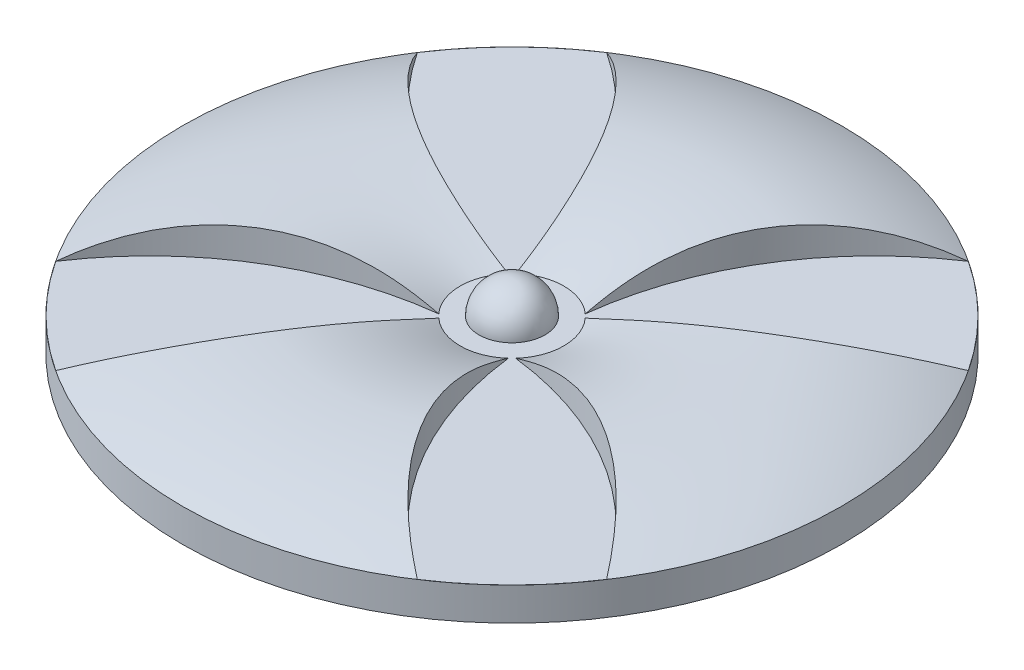
ISO-10303-21;
HEADER;
FILE_DESCRIPTION(('STEP AP214'),'2;1');
FILE_NAME('part.step','',(''),(''),'','','');
FILE_SCHEMA(('AUTOMOTIVE_DESIGN { 1 0 10303 214 1 1 1 1 }'));
ENDSEC;
DATA;
#1=APPLICATION_CONTEXT('core data for automotive mechanical design processes');
#2=APPLICATION_PROTOCOL_DEFINITION('international standard','automotive_design',2000,#1);
#3=PRODUCT_CONTEXT('',#1,'mechanical');
#4=PRODUCT('Part','Part','',(#3));
#5=PRODUCT_RELATED_PRODUCT_CATEGORY('part','',(#4));
#6=PRODUCT_DEFINITION_FORMATION('','',#4);
#7=PRODUCT_DEFINITION_CONTEXT('part definition',#1,'design');
#8=PRODUCT_DEFINITION('design','',#6,#7);
#9=PRODUCT_DEFINITION_SHAPE('','',#8);
#10=(LENGTH_UNIT() NAMED_UNIT(*) SI_UNIT(.MILLI.,.METRE.));
#11=(NAMED_UNIT(*) PLANE_ANGLE_UNIT() SI_UNIT($,.RADIAN.));
#12=(NAMED_UNIT(*) SI_UNIT($,.STERADIAN.) SOLID_ANGLE_UNIT());
#13=UNCERTAINTY_MEASURE_WITH_UNIT(LENGTH_MEASURE(1.E-05),#10,'distance_accuracy_value','');
#14=(GEOMETRIC_REPRESENTATION_CONTEXT(3) GLOBAL_UNCERTAINTY_ASSIGNED_CONTEXT((#13)) GLOBAL_UNIT_ASSIGNED_CONTEXT((#10,
#11,#12)) REPRESENTATION_CONTEXT('',''));
#15=CARTESIAN_POINT('',(0.,0.,0.));
#16=DIRECTION('',(0.,0.,1.));
#17=DIRECTION('',(1.,0.,0.));
#18=AXIS2_PLACEMENT_3D('',#15,#16,#17);
#19=CARTESIAN_POINT('',(0.,0.324,0.));
#20=DIRECTION('',(0.,-1.,0.));
#21=DIRECTION('',(0.,0.,-1.));
#22=AXIS2_PLACEMENT_3D('',#19,#20,#21);
#23=CYLINDRICAL_SURFACE('',#22,1.618);
#24=CARTESIAN_POINT('',(0.,0.161999999999954,0.));
#25=DIRECTION('',(0.,-1.,0.));
#26=DIRECTION('',(0.,0.,-1.));
#27=AXIS2_PLACEMENT_3D('',#24,#25,#26);
#28=CIRCLE('',#27,1.618);
#29=CARTESIAN_POINT('',(0.,0.162,-1.618));
#30=VERTEX_POINT('',#29);
#31=EDGE_CURVE('E445',#30,#30,#28,.T.);
#32=CARTESIAN_POINT('',(0.,0.,0.));
#33=DIRECTION('',(0.,1.,0.));
#34=DIRECTION('',(0.,0.,1.));
#35=AXIS2_PLACEMENT_3D('',#32,#33,#34);
#36=CIRCLE('',#35,1.618);
#37=CARTESIAN_POINT('',(0.,0.,-1.618));
#38=VERTEX_POINT('',#37);
#39=EDGE_CURVE('E250',#38,#38,#36,.T.);
#40=CARTESIAN_POINT('',(0.,0.162,-1.618));
#41=CARTESIAN_POINT('',(0.,0.1603125,-1.618));
#42=CARTESIAN_POINT('',(0.,0.158625,-1.618));
#43=CARTESIAN_POINT('',(0.,0.15525,-1.618));
#44=CARTESIAN_POINT('',(0.,0.1535625,-1.618));
#45=CARTESIAN_POINT('',(0.,0.1501875,-1.618));
#46=CARTESIAN_POINT('',(0.,0.1485,-1.618));
#47=CARTESIAN_POINT('',(0.,0.145125,-1.618));
#48=CARTESIAN_POINT('',(0.,0.1434375,-1.618));
#49=CARTESIAN_POINT('',(0.,0.1400625,-1.618));
#50=CARTESIAN_POINT('',(0.,0.138375,-1.618));
#51=CARTESIAN_POINT('',(0.,0.135,-1.618));
#52=CARTESIAN_POINT('',(0.,0.1333125,-1.618));
#53=CARTESIAN_POINT('',(0.,0.1299375,-1.618));
#54=CARTESIAN_POINT('',(0.,0.12825,-1.618));
#55=CARTESIAN_POINT('',(0.,0.124875,-1.618));
#56=CARTESIAN_POINT('',(0.,0.1231875,-1.618));
#57=CARTESIAN_POINT('',(0.,0.1198125,-1.618));
#58=CARTESIAN_POINT('',(0.,0.118125,-1.618));
#59=CARTESIAN_POINT('',(0.,0.11475,-1.618));
#60=CARTESIAN_POINT('',(0.,0.1130625,-1.618));
#61=CARTESIAN_POINT('',(0.,0.1096875,-1.618));
#62=CARTESIAN_POINT('',(0.,0.108,-1.618));
#63=CARTESIAN_POINT('',(0.,0.104625,-1.618));
#64=CARTESIAN_POINT('',(0.,0.1029375,-1.618));
#65=CARTESIAN_POINT('',(0.,0.0995625,-1.618));
#66=CARTESIAN_POINT('',(0.,0.0978749999999999,-1.618));
#67=CARTESIAN_POINT('',(0.,0.0945,-1.618));
#68=CARTESIAN_POINT('',(0.,0.0928125,-1.618));
#69=CARTESIAN_POINT('',(0.,0.0894375,-1.618));
#70=CARTESIAN_POINT('',(0.,0.08775,-1.618));
#71=CARTESIAN_POINT('',(0.,0.084375,-1.618));
#72=CARTESIAN_POINT('',(0.,0.0826875,-1.618));
#73=CARTESIAN_POINT('',(0.,0.0793125,-1.618));
#74=CARTESIAN_POINT('',(0.,0.077625,-1.618));
#75=CARTESIAN_POINT('',(0.,0.07425,-1.618));
#76=CARTESIAN_POINT('',(0.,0.0725625,-1.618));
#77=CARTESIAN_POINT('',(0.,0.0691875,-1.618));
#78=CARTESIAN_POINT('',(0.,0.0675,-1.618));
#79=CARTESIAN_POINT('',(0.,0.064125,-1.618));
#80=CARTESIAN_POINT('',(0.,0.0624375,-1.618));
#81=CARTESIAN_POINT('',(0.,0.0590625,-1.618));
#82=CARTESIAN_POINT('',(0.,0.057375,-1.618));
#83=CARTESIAN_POINT('',(0.,0.054,-1.618));
#84=CARTESIAN_POINT('',(0.,0.0523125,-1.618));
#85=CARTESIAN_POINT('',(0.,0.0489375,-1.618));
#86=CARTESIAN_POINT('',(0.,0.04725,-1.618));
#87=CARTESIAN_POINT('',(0.,0.043875,-1.618));
#88=CARTESIAN_POINT('',(0.,0.0421875,-1.618));
#89=CARTESIAN_POINT('',(0.,0.0388125,-1.618));
#90=CARTESIAN_POINT('',(0.,0.037125,-1.618));
#91=CARTESIAN_POINT('',(0.,0.03375,-1.618));
#92=CARTESIAN_POINT('',(0.,0.0320625,-1.618));
#93=CARTESIAN_POINT('',(0.,0.0286875,-1.618));
#94=CARTESIAN_POINT('',(0.,0.027,-1.618));
#95=CARTESIAN_POINT('',(0.,0.023625,-1.618));
#96=CARTESIAN_POINT('',(0.,0.0219375,-1.618));
#97=CARTESIAN_POINT('',(0.,0.0185625,-1.618));
#98=CARTESIAN_POINT('',(0.,0.016875,-1.618));
#99=CARTESIAN_POINT('',(0.,0.0135,-1.618));
#100=CARTESIAN_POINT('',(0.,0.0118125,-1.618));
#101=CARTESIAN_POINT('',(0.,0.00843749999999998,-1.618));
#102=CARTESIAN_POINT('',(0.,0.00674999999999997,-1.618));
#103=CARTESIAN_POINT('',(0.,0.00337499999999998,-1.618));
#104=CARTESIAN_POINT('',(0.,0.00168749999999999,-1.618));
#105=CARTESIAN_POINT('',(0.,0.,-1.618));
#106=B_SPLINE_CURVE_WITH_KNOTS('',3,(#40,#41,#42,#43,#44,#45,#46,#47,#48,#49,#50,#51,#52,#53,
#54,#55,#56,#57,#58,#59,#60,#61,#62,#63,#64,#65,#66,#67,#68,#69,#70,#71,#72,#73,#74,#75,#76,#77,
#78,#79,#80,#81,#82,#83,#84,#85,#86,#87,#88,#89,#90,#91,#92,#93,#94,#95,#96,#97,#98,#99,#100,
#101,#102,#103,#104,#105),.UNSPECIFIED.,.F.,.F.,(4,2,2,2,2,2,2,2,2,2,2,2,2,2,2,2,2,2,2,2,2,2,2,
2,2,2,2,2,2,2,2,2,4),(0.,0.00506249999999999,0.010125,0.0151875,0.02025,0.0253125,0.030375,
0.0354375,0.0405,0.0455625,0.050625,0.0556875,0.06075,0.0658125,0.070875,0.0759375,0.081,
0.0860625,0.091125,0.0961874999999999,0.10125,0.1063125,0.111375,0.1164375,0.1215,0.1265625,
0.131625,0.1366875,0.14175,0.1468125,0.151875,0.1569375,0.162),.UNSPECIFIED.);
#107=EDGE_CURVE('BSEAM243',#30,#38,#106,.T.);
#108=ORIENTED_EDGE('',*,*,#31,.T.);
#109=ORIENTED_EDGE('',*,*,#39,.T.);
#110=ORIENTED_EDGE('',*,*,#107,.T.);
#111=ORIENTED_EDGE('',*,*,#107,.F.);
#112=EDGE_LOOP('',(#108,#110,#109,#111));
#113=FACE_BOUND('',#112,.T.);
#114=ADVANCED_FACE('F243',(#113),#23,.T.);
#115=CARTESIAN_POINT('',(0.,0.,0.));
#116=DIRECTION('',(0.,1.,0.));
#117=DIRECTION('',(0.,0.,1.));
#118=AXIS2_PLACEMENT_3D('',#115,#116,#117);
#119=PLANE('',#118);
#120=ORIENTED_EDGE('',*,*,#39,.F.);
#121=EDGE_LOOP('',(#120));
#122=FACE_BOUND('',#121,.T.);
#123=ADVANCED_FACE('F389',(#122),#119,.F.);
#124=CARTESIAN_POINT('',(0.,-1.30528453187781,0.));
#125=DIRECTION('',(0.,-1.,0.));
#126=DIRECTION('',(0.,0.,-1.));
#127=AXIS2_PLACEMENT_3D('',#124,#125,#126);
#128=DEGENERATE_TOROIDAL_SURFACE('',#127,0.93609083998509,1.618,.T.);
#129=ORIENTED_EDGE('',*,*,#31,.F.);
#130=EDGE_LOOP('',(#129));
#131=FACE_BOUND('',#130,.T.);
#132=CARTESIAN_POINT('',(0.,0.1622,0.));
#133=DIRECTION('',(0.,1.,0.));
#134=DIRECTION('',(0.,0.,1.));
#135=AXIS2_PLACEMENT_3D('',#132,#133,#134);
#136=CIRCLE('',#135,0.254612191237098);
#137=CARTESIAN_POINT('',(0.170838130106348,0.162199999999998,-0.188790098332311));
#138=VERTEX_POINT('',#137);
#139=CARTESIAN_POINT('',(-0.170838130106347,0.162199999999998,-0.188790098332312));
#140=VERTEX_POINT('',#139);
#141=EDGE_CURVE('E304',#138,#140,#136,.T.);
#142=ORIENTED_EDGE('',*,*,#141,.F.);
#143=CARTESIAN_POINT('',(0.888080694463519,0.16199999999822,-1.35249276527955));
#144=CARTESIAN_POINT('',(0.860517050827818,0.176089095604927,-1.33432049104671));
#145=CARTESIAN_POINT('',(0.833207995117733,0.189304796457364,-1.31510408437488));
#146=CARTESIAN_POINT('',(0.779301533298882,0.21390226252631,-1.27457518099434));
#147=CARTESIAN_POINT('',(0.752704576087113,0.225282892630814,-1.25326139994589));
#148=CARTESIAN_POINT('',(0.674126446358543,0.256600542976333,-1.18601790688507));
#149=CARTESIAN_POINT('',(0.623583522862806,0.273598279613971,-1.13693236484038));
#150=CARTESIAN_POINT('',(0.527665983703403,0.29907263604108,-1.03042761671054));
#151=CARTESIAN_POINT('',(0.482389703109232,0.307404963343999,-0.972884959498732));
#152=CARTESIAN_POINT('',(0.399981743692752,0.314321627909982,-0.851956782261885));
#153=CARTESIAN_POINT('',(0.362822372940162,0.31293965984005,-0.788592210170187));
#154=CARTESIAN_POINT('',(0.301096591996525,0.300860564103636,-0.664916112733896));
#155=CARTESIAN_POINT('',(0.275629502566153,0.291133351030425,-0.604957986641702));
#156=CARTESIAN_POINT('',(0.243247362971764,0.27083396577333,-0.514244130356249));
#157=CARTESIAN_POINT('',(0.233414071755831,0.26310227626331,-0.483836641503997));
#158=CARTESIAN_POINT('',(0.215668507448255,0.24588377644172,-0.422960676456879));
#159=CARTESIAN_POINT('',(0.207755848075923,0.236397319729277,-0.392492213770096));
#160=CARTESIAN_POINT('',(0.194127584674697,0.21642188637036,-0.333061415712031));
#161=CARTESIAN_POINT('',(0.188326349724461,0.206000786337272,-0.304095455935736));
#162=CARTESIAN_POINT('',(0.180854213495598,0.189771083115959,-0.260741798061295));
#163=CARTESIAN_POINT('',(0.178572108374339,0.184274163990206,-0.246337826032993));
#164=CARTESIAN_POINT('',(0.17440098734889,0.173213978066154,-0.217498242259488));
#165=CARTESIAN_POINT('',(0.172511973689501,0.167650710889158,-0.203062630334076));
#166=CARTESIAN_POINT('',(0.170814675389825,0.16212382642435,-0.188590098332582));
#167=B_SPLINE_CURVE_WITH_KNOTS('',3,(#143,#144,#145,#146,#147,#148,#149,#150,#151,#152,#153,
#154,#155,#156,#157,#158,#159,#160,#161,#162,#163,#164,#165,#166),.UNSPECIFIED.,.F.,.F.,(4,2,2,
2,2,2,2,2,2,2,2,4),(0.,0.107635625406644,0.215337577213964,0.431608159199884,0.65142497029178,
0.870479709599574,1.06706784065879,1.16561882706604,1.26414997628031,1.35806043513744,
1.40481181893862,1.45156346971258),.UNSPECIFIED.);
#168=CARTESIAN_POINT('',(0.887689372648678,0.1622,-1.35223467954598));
#169=VERTEX_POINT('',#168);
#170=EDGE_CURVE('E307',#169,#138,#167,.T.);
#171=ORIENTED_EDGE('',*,*,#170,.F.);
#172=CARTESIAN_POINT('',(0.,0.1622,0.));
#173=DIRECTION('',(0.,1.,0.));
#174=DIRECTION('',(0.,0.,1.));
#175=AXIS2_PLACEMENT_3D('',#172,#173,#174);
#176=CIRCLE('',#175,1.61756948873306);
#177=CARTESIAN_POINT('',(1.3522346795553,0.162199999992799,-0.887689372662776));
#178=VERTEX_POINT('',#177);
#179=EDGE_CURVE('E322',#169,#178,#176,.F.);
#180=ORIENTED_EDGE('',*,*,#179,.T.);
#181=CARTESIAN_POINT('',(0.188590098332584,0.16212382642435,-0.170814675389824));
#182=CARTESIAN_POINT('',(0.209260844101696,0.170051184230901,-0.173240525893879));
#183=CARTESIAN_POINT('',(0.229878256762726,0.178009615774339,-0.176058119955359));
#184=CARTESIAN_POINT('',(0.27108862798526,0.193679933322635,-0.18250576735872));
#185=CARTESIAN_POINT('',(0.291681573350041,0.20139171871858,-0.186136147531294));
#186=CARTESIAN_POINT('',(0.333012281473126,0.216290504748008,-0.194256783732694));
#187=CARTESIAN_POINT('',(0.353750251921025,0.223474673290222,-0.198751269406394));
#188=CARTESIAN_POINT('',(0.395249727125005,0.237140328190551,-0.208611583371055));
#189=CARTESIAN_POINT('',(0.416011231662931,0.243621821009324,-0.213977403649514));
#190=CARTESIAN_POINT('',(0.467784693245289,0.258793425348642,-0.228473712025812));
#191=CARTESIAN_POINT('',(0.498791771229726,0.266992039747241,-0.238154185911451));
#192=CARTESIAN_POINT('',(0.560570558445592,0.281435153735575,-0.25952624348184));
#193=CARTESIAN_POINT('',(0.591342175230165,0.287678920719473,-0.271218578601497));
#194=CARTESIAN_POINT('',(0.682788380012973,0.303305523367595,-0.309244969343415));
#195=CARTESIAN_POINT('',(0.742798493840657,0.309644105530227,-0.338584693215193));
#196=CARTESIAN_POINT('',(0.858246990877504,0.314010438896997,-0.404234568274558));
#197=CARTESIAN_POINT('',(0.913729531297543,0.312131698226601,-0.44046182853807));
#198=CARTESIAN_POINT('',(1.01946559386375,0.300631998013558,-0.519069588104967));
#199=CARTESIAN_POINT('',(1.06970542875792,0.29099131857883,-0.561465534457361));
#200=CARTESIAN_POINT('',(1.16257048843386,0.26483544565712,-0.649827274079635));
#201=CARTESIAN_POINT('',(1.20535072267885,0.248492485745299,-0.695681676439331));
#202=CARTESIAN_POINT('',(1.26439332356036,0.21936699152963,-0.766560310775524));
#203=CARTESIAN_POINT('',(1.28319051080569,0.208912767248185,-0.790491381782691));
#204=CARTESIAN_POINT('',(1.31910151106976,0.186538909363238,-0.838907531906315));
#205=CARTESIAN_POINT('',(1.33621605593251,0.174619917962378,-0.863392364420406));
#206=CARTESIAN_POINT('',(1.35249276527955,0.16199999999822,-0.88808069446348));
#207=B_SPLINE_CURVE_WITH_KNOTS('',3,(#181,#182,#183,#184,#185,#186,#187,#188,#189,#190,#191,
#192,#193,#194,#195,#196,#197,#198,#199,#200,#201,#202,#203,#204,#205,#206),.UNSPECIFIED.,.F.,
.F.,(4,2,2,2,2,2,2,2,2,2,2,2,4),(0.,0.0668173972597784,0.133661710978896,0.20084195293744,
0.268021577163955,0.368401338084505,0.468818672789986,0.669001240906181,0.866911816631885,
1.06532679431907,1.25893406560958,1.35539340966282,1.45181061260496),.UNSPECIFIED.);
#208=CARTESIAN_POINT('',(0.188790098332314,0.162199999999998,-0.170838130106346));
#209=VERTEX_POINT('',#208);
#210=EDGE_CURVE('E365',#209,#178,#207,.T.);
#211=ORIENTED_EDGE('',*,*,#210,.F.);
#212=CARTESIAN_POINT('',(0.,0.1622,0.));
#213=DIRECTION('',(0.,1.,0.));
#214=DIRECTION('',(0.,0.,1.));
#215=AXIS2_PLACEMENT_3D('',#212,#213,#214);
#216=CIRCLE('',#215,0.254612191237098);
#217=CARTESIAN_POINT('',(0.188790098332315,0.162199999999988,0.170838130106353));
#218=VERTEX_POINT('',#217);
#219=EDGE_CURVE('E330',#218,#209,#216,.T.);
#220=ORIENTED_EDGE('',*,*,#219,.F.);
#221=CARTESIAN_POINT('',(1.35249276527947,0.16199999999822,0.888080694463405));
#222=CARTESIAN_POINT('',(1.33432049104662,0.176089095604924,0.860517050827708));
#223=CARTESIAN_POINT('',(1.3151040843748,0.189304796457358,0.833207995117627));
#224=CARTESIAN_POINT('',(1.27457518099426,0.213902262526299,0.779301533298784));
#225=CARTESIAN_POINT('',(1.25326139994581,0.225282892630801,0.752704576087019));
#226=CARTESIAN_POINT('',(1.18601790688499,0.256600542976313,0.674126446358462));
#227=CARTESIAN_POINT('',(1.13693236484029,0.273598279613947,0.623583522862733));
#228=CARTESIAN_POINT('',(1.03042761671046,0.299072636041051,0.527665983703343));
#229=CARTESIAN_POINT('',(0.972884959498652,0.307404963343967,0.482389703109176));
#230=CARTESIAN_POINT('',(0.851956782261804,0.314321627909946,0.399981743692706));
#231=CARTESIAN_POINT('',(0.788592210170106,0.312939659840012,0.36282237294012));
#232=CARTESIAN_POINT('',(0.664916112733815,0.300860564103595,0.301096591996492));
#233=CARTESIAN_POINT('',(0.604957986641621,0.291133351030384,0.275629502566123));
#234=CARTESIAN_POINT('',(0.514244130356168,0.270833965773287,0.243247362971738));
#235=CARTESIAN_POINT('',(0.483836641503916,0.263102276263266,0.233414071755807));
#236=CARTESIAN_POINT('',(0.422960676456799,0.245883776441676,0.215668507448235));
#237=CARTESIAN_POINT('',(0.392492213770016,0.236397319729232,0.207755848075904));
#238=CARTESIAN_POINT('',(0.333061415711965,0.216421886370318,0.194127584674684));
#239=CARTESIAN_POINT('',(0.304095455935683,0.206000786337236,0.188326349724452));
#240=CARTESIAN_POINT('',(0.260741798061262,0.189771083115931,0.180854213495593));
#241=CARTESIAN_POINT('',(0.246337826032967,0.184274163990181,0.178572108374336));
#242=CARTESIAN_POINT('',(0.217498242259474,0.173213978066135,0.174400987348889));
#243=CARTESIAN_POINT('',(0.203062630334069,0.167650710889142,0.1725119736895));
#244=CARTESIAN_POINT('',(0.188590098332581,0.162123826424337,0.170814675389826));
#245=B_SPLINE_CURVE_WITH_KNOTS('',3,(#221,#222,#223,#224,#225,#226,#227,#228,#229,#230,#231,
#232,#233,#234,#235,#236,#237,#238,#239,#240,#241,#242,#243,#244),.UNSPECIFIED.,.F.,.F.,(4,2,2,
2,2,2,2,2,2,2,2,4),(0.,0.107635625406633,0.215337577213941,0.431608159199837,0.651424970291726,
0.870479709599513,1.06706784065873,1.16561882706597,1.26414997628024,1.35806043513733,
1.40481181893849,1.45156346971242),.UNSPECIFIED.);
#246=CARTESIAN_POINT('',(1.35223467954595,0.1622,0.887689372648636));
#247=VERTEX_POINT('',#246);
#248=EDGE_CURVE('E363',#247,#218,#245,.T.);
#249=ORIENTED_EDGE('',*,*,#248,.F.);
#250=CARTESIAN_POINT('',(0.887689372662675,0.162199999992797,1.35223467955522));
#251=VERTEX_POINT('',#250);
#252=EDGE_CURVE('E368',#247,#251,#176,.F.);
#253=ORIENTED_EDGE('',*,*,#252,.T.);
#254=CARTESIAN_POINT('',(0.170814675389826,0.162123826424337,0.188590098332583));
#255=CARTESIAN_POINT('',(0.173240525893881,0.170051184230887,0.209260844101694));
#256=CARTESIAN_POINT('',(0.176058119955361,0.178009615774324,0.229878256762723));
#257=CARTESIAN_POINT('',(0.182505767358723,0.193679933322618,0.271088627985257));
#258=CARTESIAN_POINT('',(0.186136147531297,0.201391718718563,0.291681573350037));
#259=CARTESIAN_POINT('',(0.194256783732697,0.21629050474799,0.333012281473122));
#260=CARTESIAN_POINT('',(0.198751269406398,0.223474673290202,0.35375025192102));
#261=CARTESIAN_POINT('',(0.208611583371059,0.23714032819053,0.395249727125));
#262=CARTESIAN_POINT('',(0.213977403649518,0.243621821009302,0.416011231662926));
#263=CARTESIAN_POINT('',(0.228473712025816,0.258793425348619,0.467784693245283));
#264=CARTESIAN_POINT('',(0.238154185911455,0.266992039747216,0.49879177122972));
#265=CARTESIAN_POINT('',(0.259526243481844,0.281435153735548,0.560570558445585));
#266=CARTESIAN_POINT('',(0.271218578601501,0.287678920719446,0.591342175230158));
#267=CARTESIAN_POINT('',(0.30924496934342,0.303305523367564,0.682788380012965));
#268=CARTESIAN_POINT('',(0.338584693215199,0.309644105530195,0.742798493840649));
#269=CARTESIAN_POINT('',(0.404234568274563,0.314010438896961,0.858246990877494));
#270=CARTESIAN_POINT('',(0.440461828538076,0.312131698226563,0.913729531297533));
#271=CARTESIAN_POINT('',(0.519069588104972,0.300631998013517,1.01946559386374));
#272=CARTESIAN_POINT('',(0.561465534457366,0.290991318578787,1.06970542875791));
#273=CARTESIAN_POINT('',(0.649827274079623,0.264835445657078,1.16257048843382));
#274=CARTESIAN_POINT('',(0.695681676439302,0.248492485745263,1.2053507226788));
#275=CARTESIAN_POINT('',(0.766560310775467,0.219366991529606,1.26439332356029));
#276=CARTESIAN_POINT('',(0.790491381782625,0.208912767248164,1.28319051080562));
#277=CARTESIAN_POINT('',(0.838907531906229,0.186538909363227,1.31910151106968));
#278=CARTESIAN_POINT('',(0.863392364420311,0.174619917962372,1.33621605593243));
#279=CARTESIAN_POINT('',(0.888080694463375,0.16199999999822,1.35249276527946));
#280=B_SPLINE_CURVE_WITH_KNOTS('',3,(#254,#255,#256,#257,#258,#259,#260,#261,#262,#263,#264,
#265,#266,#267,#268,#269,#270,#271,#272,#273,#274,#275,#276,#277,#278,#279),.UNSPECIFIED.,.F.,
.F.,(4,2,2,2,2,2,2,2,2,2,2,2,4),(0.,0.0668173972597767,0.133661710978892,0.200841952937435,
0.268021577163948,0.368401338084498,0.468818672789977,0.669001240906171,0.866911816631873,
1.06532679431905,1.25893406560949,1.3553934096627,1.4518106126048),.UNSPECIFIED.);
#281=CARTESIAN_POINT('',(0.170838130106348,0.1622,0.188790098332311));
#282=VERTEX_POINT('',#281);
#283=EDGE_CURVE('E257',#282,#251,#280,.T.);
#284=ORIENTED_EDGE('',*,*,#283,.F.);
#285=CARTESIAN_POINT('',(0.,0.1622,0.));
#286=DIRECTION('',(0.,1.,0.));
#287=DIRECTION('',(0.,0.,1.));
#288=AXIS2_PLACEMENT_3D('',#285,#286,#287);
#289=CIRCLE('',#288,0.254612191237098);
#290=CARTESIAN_POINT('',(-0.170838130106355,0.162199999999987,0.188790098332315));
#291=VERTEX_POINT('',#290);
#292=EDGE_CURVE('E314',#291,#282,#289,.T.);
#293=ORIENTED_EDGE('',*,*,#292,.F.);
#294=CARTESIAN_POINT('',(-0.888080694463384,0.16199999999822,1.35249276527945));
#295=CARTESIAN_POINT('',(-0.860517050827688,0.176089095604924,1.3343204910466));
#296=CARTESIAN_POINT('',(-0.833207995117608,0.189304796457356,1.31510408437478));
#297=CARTESIAN_POINT('',(-0.779301533298767,0.213902262526296,1.27457518099424));
#298=CARTESIAN_POINT('',(-0.752704576087003,0.225282892630796,1.25326139994579));
#299=CARTESIAN_POINT('',(-0.674126446358448,0.256600542976306,1.18601790688497));
#300=CARTESIAN_POINT('',(-0.62358352286272,0.273598279613939,1.13693236484028));
#301=CARTESIAN_POINT('',(-0.527665983703332,0.299072636041041,1.03042761671045));
#302=CARTESIAN_POINT('',(-0.482389703109166,0.307404963343955,0.972884959498632));
#303=CARTESIAN_POINT('',(-0.399981743692696,0.314321627909933,0.851956782261783));
#304=CARTESIAN_POINT('',(-0.362822372940111,0.312939659839999,0.788592210170084));
#305=CARTESIAN_POINT('',(-0.301096591996484,0.300860564103582,0.664916112733792));
#306=CARTESIAN_POINT('',(-0.275629502566115,0.29113335103037,0.604957986641596));
#307=CARTESIAN_POINT('',(-0.243247362971731,0.270833965773272,0.514244130356142));
#308=CARTESIAN_POINT('',(-0.233414071755801,0.263102276263251,0.483836641503889));
#309=CARTESIAN_POINT('',(-0.215668507448229,0.24588377644166,0.422960676456771));
#310=CARTESIAN_POINT('',(-0.207755848075899,0.236397319729217,0.392492213769988));
#311=CARTESIAN_POINT('',(-0.19412758467468,0.216421886370306,0.333061415711941));
#312=CARTESIAN_POINT('',(-0.188326349724449,0.206000786337225,0.304095455935663));
#313=CARTESIAN_POINT('',(-0.180854213495592,0.189771083115924,0.260741798061249));
#314=CARTESIAN_POINT('',(-0.178572108374335,0.184274163990175,0.246337826032956));
#315=CARTESIAN_POINT('',(-0.174400987348889,0.173213978066131,0.217498242259468));
#316=CARTESIAN_POINT('',(-0.172511973689501,0.167650710889139,0.203062630334065));
#317=CARTESIAN_POINT('',(-0.170814675389826,0.162123826424336,0.188590098332579));
#318=B_SPLINE_CURVE_WITH_KNOTS('',3,(#294,#295,#296,#297,#298,#299,#300,#301,#302,#303,#304,
#305,#306,#307,#308,#309,#310,#311,#312,#313,#314,#315,#316,#317),.UNSPECIFIED.,.F.,.F.,(4,2,2,
2,2,2,2,2,2,2,2,4),(0.,0.10763562540663,0.215337577213936,0.431608159199827,0.651424970291717,
0.870479709599504,1.06706784065872,1.16561882706597,1.26414997628024,1.35806043513731,
1.40481181893846,1.45156346971239),.UNSPECIFIED.);
#319=CARTESIAN_POINT('',(-0.887689372648631,0.1622,1.35223467954594));
#320=VERTEX_POINT('',#319);
#321=EDGE_CURVE('E412',#320,#291,#318,.T.);
#322=ORIENTED_EDGE('',*,*,#321,.F.);
#323=CARTESIAN_POINT('',(-1.35223467955524,0.162199999992792,0.887689372662704));
#324=VERTEX_POINT('',#323);
#325=EDGE_CURVE('E450',#320,#324,#176,.F.);
#326=ORIENTED_EDGE('',*,*,#325,.T.);
#327=CARTESIAN_POINT('',(-0.188590098332582,0.162123826424337,0.170814675389824));
#328=CARTESIAN_POINT('',(-0.209260844101693,0.170051184230887,0.173240525893879));
#329=CARTESIAN_POINT('',(-0.229878256762722,0.178009615774325,0.176058119955359));
#330=CARTESIAN_POINT('',(-0.271088627985255,0.19367993332262,0.182505767358721));
#331=CARTESIAN_POINT('',(-0.291681573350035,0.201391718718566,0.186136147531294));
#332=CARTESIAN_POINT('',(-0.333012281473119,0.216290504747993,0.194256783732694));
#333=CARTESIAN_POINT('',(-0.353750251921018,0.223474673290206,0.198751269406395));
#334=CARTESIAN_POINT('',(-0.395249727124996,0.237140328190535,0.208611583371056));
#335=CARTESIAN_POINT('',(-0.416011231662922,0.243621821009307,0.213977403649515));
#336=CARTESIAN_POINT('',(-0.467784693245279,0.258793425348625,0.228473712025812));
#337=CARTESIAN_POINT('',(-0.498791771229714,0.266992039747223,0.238154185911451));
#338=CARTESIAN_POINT('',(-0.560570558445579,0.281435153735556,0.259526243481839));
#339=CARTESIAN_POINT('',(-0.591342175230151,0.287678920719454,0.271218578601495));
#340=CARTESIAN_POINT('',(-0.682788380012957,0.303305523367575,0.309244969343413));
#341=CARTESIAN_POINT('',(-0.74279849384064,0.309644105530206,0.33858469321519));
#342=CARTESIAN_POINT('',(-0.858246990877483,0.314010438896974,0.404234568274552));
#343=CARTESIAN_POINT('',(-0.913729531297522,0.312131698226577,0.440461828538064));
#344=CARTESIAN_POINT('',(-1.01946559386373,0.300631998013533,0.519069588104957));
#345=CARTESIAN_POINT('',(-1.0697054287579,0.290991318578804,0.561465534457349));
#346=CARTESIAN_POINT('',(-1.16257048843382,0.264835445657095,0.649827274079611));
#347=CARTESIAN_POINT('',(-1.2053507226788,0.248492485745277,0.695681676439296));
#348=CARTESIAN_POINT('',(-1.2643933235603,0.219366991529616,0.76656031077547));
#349=CARTESIAN_POINT('',(-1.28319051080563,0.208912767248172,0.790491381782631));
#350=CARTESIAN_POINT('',(-1.3191015110697,0.186538909363231,0.838907531906242));
#351=CARTESIAN_POINT('',(-1.33621605593245,0.174619917962374,0.863392364420327));
#352=CARTESIAN_POINT('',(-1.35249276527948,0.16199999999822,0.888080694463395));
#353=B_SPLINE_CURVE_WITH_KNOTS('',3,(#327,#328,#329,#330,#331,#332,#333,#334,#335,#336,#337,
#338,#339,#340,#341,#342,#343,#344,#345,#346,#347,#348,#349,#350,#351,#352),.UNSPECIFIED.,.F.,
.F.,(4,2,2,2,2,2,2,2,2,2,2,2,4),(0.,0.0668173972597764,0.133661710978892,0.200841952937434,
0.268021577163947,0.368401338084495,0.468818672789972,0.669001240906163,0.866911816631861,
1.06532679431904,1.2589340656095,1.35539340966272,1.45181061260484),.UNSPECIFIED.);
#354=CARTESIAN_POINT('',(-0.188790098332317,0.162199999999988,0.170838130106352));
#355=VERTEX_POINT('',#354);
#356=EDGE_CURVE('E321',#355,#324,#353,.T.);
#357=ORIENTED_EDGE('',*,*,#356,.F.);
#358=CARTESIAN_POINT('',(-0.188790098332309,0.162199999999998,-0.170838130106351));
#359=VERTEX_POINT('',#358);
#360=EDGE_CURVE('E315',#359,#355,#136,.T.);
#361=ORIENTED_EDGE('',*,*,#360,.F.);
#362=CARTESIAN_POINT('',(-1.35249276527953,0.16199999999822,-0.888080694463508));
#363=CARTESIAN_POINT('',(-1.33432049104668,0.176089095604926,-0.860517050827808));
#364=CARTESIAN_POINT('',(-1.31510408437485,0.189304796457362,-0.833207995117724));
#365=CARTESIAN_POINT('',(-1.27457518099432,0.213902262526306,-0.779301533298874));
#366=CARTESIAN_POINT('',(-1.25326139994587,0.22528289263081,-0.752704576087106));
#367=CARTESIAN_POINT('',(-1.18601790688505,0.256600542976326,-0.674126446358537));
#368=CARTESIAN_POINT('',(-1.13693236484035,0.273598279613962,-0.623583522862801));
#369=CARTESIAN_POINT('',(-1.03042761671052,0.29907263604107,-0.527665983703399));
#370=CARTESIAN_POINT('',(-0.972884959498708,0.307404963343987,-0.482389703109228));
#371=CARTESIAN_POINT('',(-0.85195678226186,0.314321627909969,-0.399981743692749));
#372=CARTESIAN_POINT('',(-0.788592210170162,0.312939659840036,-0.362822372940159));
#373=CARTESIAN_POINT('',(-0.66491611273387,0.300860564103621,-0.301096591996523));
#374=CARTESIAN_POINT('',(-0.604957986641675,0.291133351030411,-0.27562950256615));
#375=CARTESIAN_POINT('',(-0.514244130356221,0.270833965773315,-0.243247362971761));
#376=CARTESIAN_POINT('',(-0.483836641503968,0.263102276263295,-0.233414071755828));
#377=CARTESIAN_POINT('',(-0.422960676456849,0.245883776441705,-0.215668507448252));
#378=CARTESIAN_POINT('',(-0.392492213770066,0.236397319729263,-0.207755848075921));
#379=CARTESIAN_POINT('',(-0.333061415712005,0.216421886370347,-0.194127584674696));
#380=CARTESIAN_POINT('',(-0.304095455935715,0.206000786337261,-0.188326349724461));
#381=CARTESIAN_POINT('',(-0.260741798061281,0.189771083115952,-0.180854213495599));
#382=CARTESIAN_POINT('',(-0.246337826032982,0.1842741639902,-0.178572108374341));
#383=CARTESIAN_POINT('',(-0.217498242259481,0.173213978066151,-0.174400987348892));
#384=CARTESIAN_POINT('',(-0.203062630334072,0.167650710889156,-0.172511973689503));
#385=CARTESIAN_POINT('',(-0.18859009833258,0.16212382642435,-0.170814675389828));
#386=B_SPLINE_CURVE_WITH_KNOTS('',3,(#362,#363,#364,#365,#366,#367,#368,#369,#370,#371,#372,
#373,#374,#375,#376,#377,#378,#379,#380,#381,#382,#383,#384,#385),.UNSPECIFIED.,.F.,.F.,(4,2,2,
2,2,2,2,2,2,2,2,4),(0.,0.107635625406642,0.215337577213959,0.431608159199874,0.65142497029177,
0.870479709599565,1.06706784065878,1.16561882706603,1.26414997628031,1.35806043513742,
1.40481181893859,1.45156346971254),.UNSPECIFIED.);
#387=CARTESIAN_POINT('',(-1.35223467954599,0.162200000000001,-0.88768937264871));
#388=VERTEX_POINT('',#387);
#389=EDGE_CURVE('E418',#388,#359,#386,.T.);
#390=ORIENTED_EDGE('',*,*,#389,.F.);
#391=CARTESIAN_POINT('',(-0.887689372648668,0.1622,-1.35223467954599));
#392=VERTEX_POINT('',#391);
#393=EDGE_CURVE('E264',#388,#392,#176,.F.);
#394=ORIENTED_EDGE('',*,*,#393,.T.);
#395=CARTESIAN_POINT('',(-0.170814675389824,0.16212382642435,-0.188590098332583));
#396=CARTESIAN_POINT('',(-0.173240525893879,0.170051184230901,-0.209260844101694));
#397=CARTESIAN_POINT('',(-0.176058119955359,0.17800961577434,-0.229878256762724));
#398=CARTESIAN_POINT('',(-0.18250576735872,0.193679933322637,-0.271088627985257));
#399=CARTESIAN_POINT('',(-0.186136147531294,0.201391718718583,-0.291681573350038));
#400=CARTESIAN_POINT('',(-0.194256783732694,0.216290504748012,-0.333012281473122));
#401=CARTESIAN_POINT('',(-0.198751269406395,0.223474673290226,-0.353750251921021));
#402=CARTESIAN_POINT('',(-0.208611583371056,0.237140328190556,-0.395249727125001));
#403=CARTESIAN_POINT('',(-0.213977403649515,0.243621821009329,-0.416011231662927));
#404=CARTESIAN_POINT('',(-0.228473712025812,0.258793425348649,-0.467784693245284));
#405=CARTESIAN_POINT('',(-0.238154185911451,0.266992039747248,-0.49879177122972));
#406=CARTESIAN_POINT('',(-0.25952624348184,0.281435153735583,-0.560570558445585));
#407=CARTESIAN_POINT('',(-0.271218578601496,0.287678920719482,-0.591342175230158));
#408=CARTESIAN_POINT('',(-0.309244969343413,0.303305523367605,-0.682788380012964));
#409=CARTESIAN_POINT('',(-0.338584693215191,0.309644105530239,-0.742798493840648));
#410=CARTESIAN_POINT('',(-0.404234568274554,0.31401043889701,-0.858246990877492));
#411=CARTESIAN_POINT('',(-0.440461828538066,0.312131698226615,-0.913729531297531));
#412=CARTESIAN_POINT('',(-0.519069588104961,0.300631998013574,-1.01946559386374));
#413=CARTESIAN_POINT('',(-0.561465534457354,0.290991318578847,-1.06970542875791));
#414=CARTESIAN_POINT('',(-0.649827274079632,0.264835445657136,-1.16257048843385));
#415=CARTESIAN_POINT('',(-0.695681676439335,0.248492485745313,-1.20535072267885));
#416=CARTESIAN_POINT('',(-0.766560310775537,0.21936699152964,-1.26439332356036));
#417=CARTESIAN_POINT('',(-0.790491381782707,0.208912767248193,-1.28319051080569));
#418=CARTESIAN_POINT('',(-0.838907531906337,0.186538909363243,-1.31910151106977));
#419=CARTESIAN_POINT('',(-0.863392364420432,0.17461991796238,-1.33621605593253));
#420=CARTESIAN_POINT('',(-0.888080694463509,0.16199999999822,-1.35249276527956));
#421=B_SPLINE_CURVE_WITH_KNOTS('',3,(#395,#396,#397,#398,#399,#400,#401,#402,#403,#404,#405,
#406,#407,#408,#409,#410,#411,#412,#413,#414,#415,#416,#417,#418,#419,#420),.UNSPECIFIED.,.F.,
.F.,(4,2,2,2,2,2,2,2,2,2,2,2,4),(0.,0.0668173972597783,0.133661710978895,0.20084195293744,
0.268021577163954,0.368401338084503,0.468818672789982,0.669001240906175,0.866911816631876,
1.06532679431905,1.25893406560959,1.35539340966284,1.45181061260499),.UNSPECIFIED.);
#422=EDGE_CURVE('E309',#140,#392,#421,.T.);
#423=ORIENTED_EDGE('',*,*,#422,.F.);
#424=EDGE_LOOP('',(#142,#171,#180,#211,#220,#249,#253,#284,#293,#322,#326,#357,#361,#390,#394,#423));
#425=FACE_BOUND('',#424,.T.);
#426=ADVANCED_FACE('F306',(#131,#425),#128,.T.);
#427=CARTESIAN_POINT('',(0.,0.1622,0.));
#428=DIRECTION('',(0.,-1.,0.));
#429=DIRECTION('',(1.,0.,0.));
#430=AXIS2_PLACEMENT_3D('',#427,#428,#429);
#431=SPHERICAL_SURFACE('',#430,0.1618);
#432=CARTESIAN_POINT('',(0.,0.1622,0.));
#433=DIRECTION('',(0.,1.,0.));
#434=DIRECTION('',(0.,0.,1.));
#435=AXIS2_PLACEMENT_3D('',#432,#433,#434);
#436=CIRCLE('',#435,0.1618);
#437=CARTESIAN_POINT('',(0.,0.1622,0.1618));
#438=VERTEX_POINT('',#437);
#439=EDGE_CURVE('E12',#438,#438,#436,.T.);
#440=ORIENTED_EDGE('',*,*,#439,.T.);
#441=EDGE_LOOP('',(#440));
#442=FACE_BOUND('',#441,.T.);
#443=ADVANCED_FACE('F388',(#442),#431,.T.);
#444=CARTESIAN_POINT('',(0.,0.1622,1.7798));
#445=DIRECTION('',(0.,1.,0.));
#446=DIRECTION('',(0.,0.,1.));
#447=AXIS2_PLACEMENT_3D('',#444,#445,#446);
#448=CYLINDRICAL_SURFACE('',#447,1.62);
#449=CARTESIAN_POINT('',(0.,0.1622,1.7798));
#450=DIRECTION('',(0.,1.,0.));
#451=DIRECTION('',(0.,0.,1.));
#452=AXIS2_PLACEMENT_3D('',#449,#450,#451);
#453=CIRCLE('',#452,1.62);
#454=EDGE_CURVE('E342',#355,#324,#453,.T.);
#455=ORIENTED_EDGE('',*,*,#454,.F.);
#456=ORIENTED_EDGE('',*,*,#356,.T.);
#457=EDGE_LOOP('',(#455,#456));
#458=FACE_BOUND('',#457,.T.);
#459=ADVANCED_FACE('F456',(#458),#448,.F.);
#460=CARTESIAN_POINT('',(-1.7798,0.1622,0.));
#461=DIRECTION('',(0.,1.,0.));
#462=DIRECTION('',(0.,0.,1.));
#463=AXIS2_PLACEMENT_3D('',#460,#461,#462);
#464=CYLINDRICAL_SURFACE('',#463,1.62);
#465=CARTESIAN_POINT('',(-1.7798,0.1622,0.));
#466=DIRECTION('',(0.,1.,0.));
#467=DIRECTION('',(0.,0.,1.));
#468=AXIS2_PLACEMENT_3D('',#465,#466,#467);
#469=CIRCLE('',#468,1.62);
#470=EDGE_CURVE('E346',#140,#392,#469,.T.);
#471=ORIENTED_EDGE('',*,*,#470,.F.);
#472=ORIENTED_EDGE('',*,*,#422,.T.);
#473=EDGE_LOOP('',(#471,#472));
#474=FACE_BOUND('',#473,.T.);
#475=ADVANCED_FACE('F433',(#474),#464,.F.);
#476=CARTESIAN_POINT('',(0.,0.1622,-1.7798));
#477=DIRECTION('',(0.,1.,0.));
#478=DIRECTION('',(0.,0.,1.));
#479=AXIS2_PLACEMENT_3D('',#476,#477,#478);
#480=CYLINDRICAL_SURFACE('',#479,1.62);
#481=CARTESIAN_POINT('',(0.,0.1622,-1.7798));
#482=DIRECTION('',(0.,1.,0.));
#483=DIRECTION('',(0.,0.,1.));
#484=AXIS2_PLACEMENT_3D('',#481,#482,#483);
#485=CIRCLE('',#484,1.62);
#486=EDGE_CURVE('E328',#209,#178,#485,.T.);
#487=ORIENTED_EDGE('',*,*,#486,.F.);
#488=ORIENTED_EDGE('',*,*,#210,.T.);
#489=EDGE_LOOP('',(#487,#488));
#490=FACE_BOUND('',#489,.T.);
#491=ADVANCED_FACE('F462',(#490),#480,.F.);
#492=CARTESIAN_POINT('',(1.7798,0.1622,0.));
#493=DIRECTION('',(0.,1.,0.));
#494=DIRECTION('',(0.,0.,1.));
#495=AXIS2_PLACEMENT_3D('',#492,#493,#494);
#496=CYLINDRICAL_SURFACE('',#495,1.62);
#497=CARTESIAN_POINT('',(1.7798,0.1622,0.));
#498=DIRECTION('',(0.,1.,0.));
#499=DIRECTION('',(0.,0.,1.));
#500=AXIS2_PLACEMENT_3D('',#497,#498,#499);
#501=CIRCLE('',#500,1.62);
#502=EDGE_CURVE('E336',#282,#251,#501,.T.);
#503=ORIENTED_EDGE('',*,*,#502,.F.);
#504=ORIENTED_EDGE('',*,*,#283,.T.);
#505=EDGE_LOOP('',(#503,#504));
#506=FACE_BOUND('',#505,.T.);
#507=ADVANCED_FACE('F447',(#506),#496,.F.);
#508=CARTESIAN_POINT('',(0.,0.1622,0.));
#509=DIRECTION('',(0.,1.,0.));
#510=DIRECTION('',(0.,0.,1.));
#511=AXIS2_PLACEMENT_3D('',#508,#509,#510);
#512=PLANE('',#511);
#513=ORIENTED_EDGE('',*,*,#360,.T.);
#514=ORIENTED_EDGE('',*,*,#454,.T.);
#515=ORIENTED_EDGE('',*,*,#325,.F.);
#516=CARTESIAN_POINT('',(-1.7798,0.1622,0.));
#517=DIRECTION('',(0.,1.,0.));
#518=DIRECTION('',(0.,0.,1.));
#519=AXIS2_PLACEMENT_3D('',#516,#517,#518);
#520=CIRCLE('',#519,1.62);
#521=EDGE_CURVE('E348',#320,#291,#520,.T.);
#522=ORIENTED_EDGE('',*,*,#521,.T.);
#523=ORIENTED_EDGE('',*,*,#292,.T.);
#524=ORIENTED_EDGE('',*,*,#502,.T.);
#525=ORIENTED_EDGE('',*,*,#252,.F.);
#526=CARTESIAN_POINT('',(0.,0.1622,1.7798));
#527=DIRECTION('',(0.,1.,0.));
#528=DIRECTION('',(0.,0.,1.));
#529=AXIS2_PLACEMENT_3D('',#526,#527,#528);
#530=CIRCLE('',#529,1.62);
#531=EDGE_CURVE('E339',#247,#218,#530,.T.);
#532=ORIENTED_EDGE('',*,*,#531,.T.);
#533=ORIENTED_EDGE('',*,*,#219,.T.);
#534=ORIENTED_EDGE('',*,*,#486,.T.);
#535=ORIENTED_EDGE('',*,*,#179,.F.);
#536=CARTESIAN_POINT('',(1.7798,0.1622,0.));
#537=DIRECTION('',(0.,1.,0.));
#538=DIRECTION('',(0.,0.,1.));
#539=AXIS2_PLACEMENT_3D('',#536,#537,#538);
#540=CIRCLE('',#539,1.62);
#541=EDGE_CURVE('E320',#169,#138,#540,.T.);
#542=ORIENTED_EDGE('',*,*,#541,.T.);
#543=ORIENTED_EDGE('',*,*,#141,.T.);
#544=ORIENTED_EDGE('',*,*,#470,.T.);
#545=ORIENTED_EDGE('',*,*,#393,.F.);
#546=CARTESIAN_POINT('',(0.,0.1622,-1.7798));
#547=DIRECTION('',(0.,1.,0.));
#548=DIRECTION('',(0.,0.,1.));
#549=AXIS2_PLACEMENT_3D('',#546,#547,#548);
#550=CIRCLE('',#549,1.62);
#551=EDGE_CURVE('E343',#388,#359,#550,.T.);
#552=ORIENTED_EDGE('',*,*,#551,.T.);
#553=EDGE_LOOP('',(#513,#514,#515,#522,#523,#524,#525,#532,#533,#534,#535,#542,#543,#544,#545,#552));
#554=FACE_BOUND('',#553,.T.);
#555=ORIENTED_EDGE('',*,*,#439,.F.);
#556=EDGE_LOOP('',(#555));
#557=FACE_BOUND('',#556,.T.);
#558=ADVANCED_FACE('F325',(#554,#557),#512,.T.);
#559=CARTESIAN_POINT('',(0.,0.1622,1.7798));
#560=DIRECTION('',(0.,1.,0.));
#561=DIRECTION('',(0.,0.,1.));
#562=AXIS2_PLACEMENT_3D('',#559,#560,#561);
#563=CYLINDRICAL_SURFACE('',#562,1.62);
#564=ORIENTED_EDGE('',*,*,#531,.F.);
#565=ORIENTED_EDGE('',*,*,#248,.T.);
#566=EDGE_LOOP('',(#564,#565));
#567=FACE_BOUND('',#566,.T.);
#568=ADVANCED_FACE('F367',(#567),#563,.F.);
#569=CARTESIAN_POINT('',(1.7798,0.1622,0.));
#570=DIRECTION('',(0.,1.,0.));
#571=DIRECTION('',(0.,0.,1.));
#572=AXIS2_PLACEMENT_3D('',#569,#570,#571);
#573=CYLINDRICAL_SURFACE('',#572,1.62);
#574=ORIENTED_EDGE('',*,*,#541,.F.);
#575=ORIENTED_EDGE('',*,*,#170,.T.);
#576=EDGE_LOOP('',(#574,#575));
#577=FACE_BOUND('',#576,.T.);
#578=ADVANCED_FACE('F319',(#577),#573,.F.);
#579=CARTESIAN_POINT('',(0.,0.1622,-1.7798));
#580=DIRECTION('',(0.,1.,0.));
#581=DIRECTION('',(0.,0.,1.));
#582=AXIS2_PLACEMENT_3D('',#579,#580,#581);
#583=CYLINDRICAL_SURFACE('',#582,1.62);
#584=ORIENTED_EDGE('',*,*,#551,.F.);
#585=ORIENTED_EDGE('',*,*,#389,.T.);
#586=EDGE_LOOP('',(#584,#585));
#587=FACE_BOUND('',#586,.T.);
#588=ADVANCED_FACE('F428',(#587),#583,.F.);
#589=CARTESIAN_POINT('',(-1.7798,0.1622,0.));
#590=DIRECTION('',(0.,1.,0.));
#591=DIRECTION('',(0.,0.,1.));
#592=AXIS2_PLACEMENT_3D('',#589,#590,#591);
#593=CYLINDRICAL_SURFACE('',#592,1.62);
#594=ORIENTED_EDGE('',*,*,#521,.F.);
#595=ORIENTED_EDGE('',*,*,#321,.T.);
#596=EDGE_LOOP('',(#594,#595));
#597=FACE_BOUND('',#596,.T.);
#598=ADVANCED_FACE('F431',(#597),#593,.F.);
#599=CLOSED_SHELL('',(#114,#123,#426,#443,#459,#475,#491,#507,#558,#568,#578,#588,#598));
#600=MANIFOLD_SOLID_BREP('B2',#599);
#601=ADVANCED_BREP_SHAPE_REPRESENTATION('',(#18,#600),#14);
#602=SHAPE_DEFINITION_REPRESENTATION(#9,#601);
ENDSEC;
END-ISO-10303-21;
